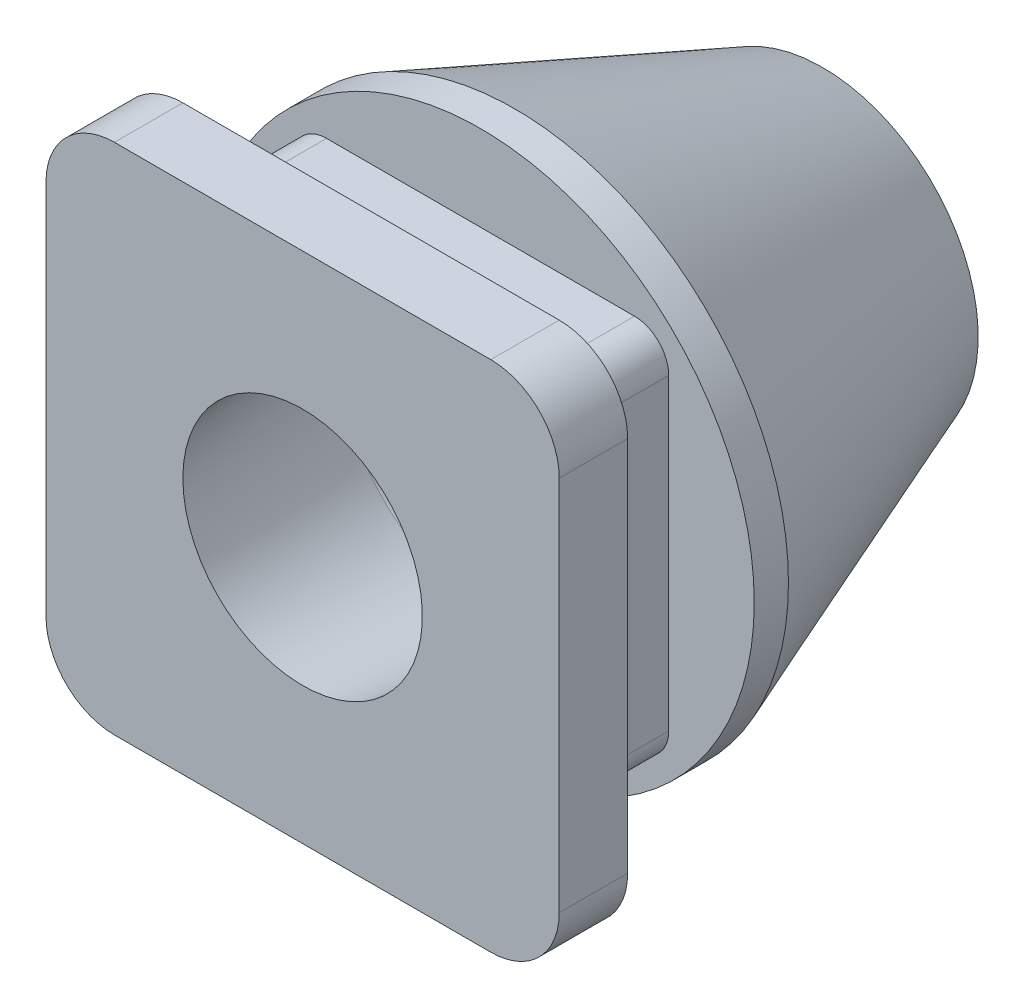
ISO-10303-21;
HEADER;
FILE_DESCRIPTION(('STEP AP214'),'2;1');
FILE_NAME('part.step','',(''),(''),'','','');
FILE_SCHEMA(('AUTOMOTIVE_DESIGN { 1 0 10303 214 1 1 1 1 }'));
ENDSEC;
DATA;
#1=APPLICATION_CONTEXT('core data for automotive mechanical design processes');
#2=APPLICATION_PROTOCOL_DEFINITION('international standard','automotive_design',2000,#1);
#3=PRODUCT_CONTEXT('',#1,'mechanical');
#4=PRODUCT('Part','Part','',(#3));
#5=PRODUCT_RELATED_PRODUCT_CATEGORY('part','',(#4));
#6=PRODUCT_DEFINITION_FORMATION('','',#4);
#7=PRODUCT_DEFINITION_CONTEXT('part definition',#1,'design');
#8=PRODUCT_DEFINITION('design','',#6,#7);
#9=PRODUCT_DEFINITION_SHAPE('','',#8);
#10=(LENGTH_UNIT() NAMED_UNIT(*) SI_UNIT(.MILLI.,.METRE.));
#11=(NAMED_UNIT(*) PLANE_ANGLE_UNIT() SI_UNIT($,.RADIAN.));
#12=(NAMED_UNIT(*) SI_UNIT($,.STERADIAN.) SOLID_ANGLE_UNIT());
#13=UNCERTAINTY_MEASURE_WITH_UNIT(LENGTH_MEASURE(1.E-05),#10,'distance_accuracy_value','');
#14=(GEOMETRIC_REPRESENTATION_CONTEXT(3) GLOBAL_UNCERTAINTY_ASSIGNED_CONTEXT((#13)) GLOBAL_UNIT_ASSIGNED_CONTEXT((#10,
#11,#12)) REPRESENTATION_CONTEXT('',''));
#15=CARTESIAN_POINT('',(0.,0.,0.));
#16=DIRECTION('',(0.,0.,1.));
#17=DIRECTION('',(1.,0.,0.));
#18=AXIS2_PLACEMENT_3D('',#15,#16,#17);
#19=CARTESIAN_POINT('',(0.,0.,2.));
#20=DIRECTION('',(0.,0.,-1.));
#21=DIRECTION('',(-1.,0.,0.));
#22=AXIS2_PLACEMENT_3D('',#19,#20,#21);
#23=PLANE('',#22);
#24=DIRECTION('',(1.,0.,0.));
#25=VECTOR('',#24,1.);
#26=CARTESIAN_POINT('',(-7.5,-7.5,2.));
#27=LINE('',#26,#25);
#28=CARTESIAN_POINT('',(-5.5,-7.5,2.));
#29=VERTEX_POINT('',#28);
#30=CARTESIAN_POINT('',(5.5,-7.5,2.));
#31=VERTEX_POINT('',#30);
#32=EDGE_CURVE('E192',#29,#31,#27,.T.);
#33=ORIENTED_EDGE('',*,*,#32,.T.);
#34=CARTESIAN_POINT('',(5.5,-5.5,2.));
#35=DIRECTION('',(0.,0.,-1.));
#36=DIRECTION('',(-1.,0.,0.));
#37=AXIS2_PLACEMENT_3D('',#34,#35,#36);
#38=CIRCLE('',#37,2.);
#39=CARTESIAN_POINT('',(7.5,-5.5,2.));
#40=VERTEX_POINT('',#39);
#41=EDGE_CURVE('E222',#31,#40,#38,.F.);
#42=ORIENTED_EDGE('',*,*,#41,.T.);
#43=DIRECTION('',(0.,1.,0.));
#44=VECTOR('',#43,1.);
#45=CARTESIAN_POINT('',(7.5,-7.5,2.));
#46=LINE('',#45,#44);
#47=CARTESIAN_POINT('',(7.5,5.5,2.));
#48=VERTEX_POINT('',#47);
#49=EDGE_CURVE('E176',#40,#48,#46,.T.);
#50=ORIENTED_EDGE('',*,*,#49,.T.);
#51=CARTESIAN_POINT('',(5.5,5.5,2.));
#52=DIRECTION('',(0.,0.,-1.));
#53=DIRECTION('',(-1.,0.,0.));
#54=AXIS2_PLACEMENT_3D('',#51,#52,#53);
#55=CIRCLE('',#54,2.);
#56=CARTESIAN_POINT('',(5.5,7.5,2.));
#57=VERTEX_POINT('',#56);
#58=EDGE_CURVE('E216',#48,#57,#55,.F.);
#59=ORIENTED_EDGE('',*,*,#58,.T.);
#60=DIRECTION('',(-1.,0.,0.));
#61=VECTOR('',#60,1.);
#62=CARTESIAN_POINT('',(-7.5,7.5,2.));
#63=LINE('',#62,#61);
#64=CARTESIAN_POINT('',(-5.5,7.5,2.));
#65=VERTEX_POINT('',#64);
#66=EDGE_CURVE('E297',#57,#65,#63,.T.);
#67=ORIENTED_EDGE('',*,*,#66,.T.);
#68=CARTESIAN_POINT('',(-5.5,5.5,2.));
#69=DIRECTION('',(0.,0.,-1.));
#70=DIRECTION('',(-1.,0.,0.));
#71=AXIS2_PLACEMENT_3D('',#68,#69,#70);
#72=CIRCLE('',#71,2.);
#73=CARTESIAN_POINT('',(-7.5,5.5,2.));
#74=VERTEX_POINT('',#73);
#75=EDGE_CURVE('E218',#65,#74,#72,.F.);
#76=ORIENTED_EDGE('',*,*,#75,.T.);
#77=DIRECTION('',(0.,-1.,0.));
#78=VECTOR('',#77,1.);
#79=CARTESIAN_POINT('',(-7.5,-7.5,2.));
#80=LINE('',#79,#78);
#81=CARTESIAN_POINT('',(-7.5,-5.5,2.));
#82=VERTEX_POINT('',#81);
#83=EDGE_CURVE('E299',#74,#82,#80,.T.);
#84=ORIENTED_EDGE('',*,*,#83,.T.);
#85=CARTESIAN_POINT('',(-5.5,-5.5,2.));
#86=DIRECTION('',(0.,0.,-1.));
#87=DIRECTION('',(-1.,0.,0.));
#88=AXIS2_PLACEMENT_3D('',#85,#86,#87);
#89=CIRCLE('',#88,2.);
#90=EDGE_CURVE('E220',#82,#29,#89,.F.);
#91=ORIENTED_EDGE('',*,*,#90,.T.);
#92=EDGE_LOOP('',(#33,#42,#50,#59,#67,#76,#84,#91));
#93=FACE_BOUND('',#92,.T.);
#94=CARTESIAN_POINT('',(0.,0.,2.));
#95=DIRECTION('',(0.,0.,-1.));
#96=DIRECTION('',(-1.,0.,0.));
#97=AXIS2_PLACEMENT_3D('',#94,#95,#96);
#98=CIRCLE('',#97,3.5);
#99=CARTESIAN_POINT('',(-3.5,0.,2.));
#100=VERTEX_POINT('',#99);
#101=EDGE_CURVE('E664',#100,#100,#98,.T.);
#102=ORIENTED_EDGE('',*,*,#101,.T.);
#103=EDGE_LOOP('',(#102));
#104=FACE_BOUND('',#103,.T.);
#105=ADVANCED_FACE('F43',(#93,#104),#23,.F.);
#106=CARTESIAN_POINT('',(0.,0.,0.));
#107=DIRECTION('',(0.,0.,-1.));
#108=DIRECTION('',(-1.,0.,0.));
#109=AXIS2_PLACEMENT_3D('',#106,#107,#108);
#110=PLANE('',#109);
#111=DIRECTION('',(0.,1.,0.));
#112=VECTOR('',#111,1.);
#113=CARTESIAN_POINT('',(-5.5,5.5,0.));
#114=LINE('',#113,#112);
#115=CARTESIAN_POINT('',(-5.5,-4.5,0.));
#116=VERTEX_POINT('',#115);
#117=CARTESIAN_POINT('',(-5.5,4.5,0.));
#118=VERTEX_POINT('',#117);
#119=EDGE_CURVE('E268',#116,#118,#114,.T.);
#120=ORIENTED_EDGE('',*,*,#119,.F.);
#121=CARTESIAN_POINT('',(-4.5,-4.5,0.));
#122=DIRECTION('',(0.,0.,-1.));
#123=DIRECTION('',(-1.,0.,0.));
#124=AXIS2_PLACEMENT_3D('',#121,#122,#123);
#125=CIRCLE('',#124,1.);
#126=CARTESIAN_POINT('',(-4.5,-5.5,0.));
#127=VERTEX_POINT('',#126);
#128=EDGE_CURVE('E253',#116,#127,#125,.F.);
#129=ORIENTED_EDGE('',*,*,#128,.T.);
#130=DIRECTION('',(-1.,0.,0.));
#131=VECTOR('',#130,1.);
#132=CARTESIAN_POINT('',(5.5,-5.5,0.));
#133=LINE('',#132,#131);
#134=CARTESIAN_POINT('',(4.5,-5.5,0.));
#135=VERTEX_POINT('',#134);
#136=EDGE_CURVE('E286',#135,#127,#133,.T.);
#137=ORIENTED_EDGE('',*,*,#136,.F.);
#138=CARTESIAN_POINT('',(4.5,-4.5,0.));
#139=DIRECTION('',(0.,0.,-1.));
#140=DIRECTION('',(-1.,0.,0.));
#141=AXIS2_PLACEMENT_3D('',#138,#139,#140);
#142=CIRCLE('',#141,1.);
#143=CARTESIAN_POINT('',(5.5,-4.5,0.));
#144=VERTEX_POINT('',#143);
#145=EDGE_CURVE('E257',#135,#144,#142,.F.);
#146=ORIENTED_EDGE('',*,*,#145,.T.);
#147=DIRECTION('',(0.,-1.,0.));
#148=VECTOR('',#147,1.);
#149=CARTESIAN_POINT('',(5.5,5.5,0.));
#150=LINE('',#149,#148);
#151=CARTESIAN_POINT('',(5.5,4.5,0.));
#152=VERTEX_POINT('',#151);
#153=EDGE_CURVE('E291',#152,#144,#150,.T.);
#154=ORIENTED_EDGE('',*,*,#153,.F.);
#155=CARTESIAN_POINT('',(4.5,4.5,0.));
#156=DIRECTION('',(0.,0.,-1.));
#157=DIRECTION('',(-1.,0.,0.));
#158=AXIS2_PLACEMENT_3D('',#155,#156,#157);
#159=CIRCLE('',#158,1.);
#160=CARTESIAN_POINT('',(4.5,5.5,0.));
#161=VERTEX_POINT('',#160);
#162=EDGE_CURVE('E261',#152,#161,#159,.F.);
#163=ORIENTED_EDGE('',*,*,#162,.T.);
#164=DIRECTION('',(1.,0.,0.));
#165=VECTOR('',#164,1.);
#166=CARTESIAN_POINT('',(5.5,5.5,0.));
#167=LINE('',#166,#165);
#168=CARTESIAN_POINT('',(-4.5,5.5,0.));
#169=VERTEX_POINT('',#168);
#170=EDGE_CURVE('E269',#169,#161,#167,.T.);
#171=ORIENTED_EDGE('',*,*,#170,.F.);
#172=CARTESIAN_POINT('',(-4.5,4.5,0.));
#173=DIRECTION('',(0.,0.,-1.));
#174=DIRECTION('',(-1.,0.,0.));
#175=AXIS2_PLACEMENT_3D('',#172,#173,#174);
#176=CIRCLE('',#175,1.);
#177=EDGE_CURVE('E51',#169,#118,#176,.F.);
#178=ORIENTED_EDGE('',*,*,#177,.T.);
#179=EDGE_LOOP('',(#120,#129,#137,#146,#154,#163,#171,#178));
#180=FACE_BOUND('',#179,.T.);
#181=DIRECTION('',(0.,1.,0.));
#182=VECTOR('',#181,1.);
#183=CARTESIAN_POINT('',(7.5,-7.5,0.));
#184=LINE('',#183,#182);
#185=CARTESIAN_POINT('',(7.5,-5.5,0.));
#186=VERTEX_POINT('',#185);
#187=CARTESIAN_POINT('',(7.5,5.5,0.));
#188=VERTEX_POINT('',#187);
#189=EDGE_CURVE('E173',#186,#188,#184,.T.);
#190=ORIENTED_EDGE('',*,*,#189,.F.);
#191=CARTESIAN_POINT('',(5.5,-5.5,0.));
#192=DIRECTION('',(0.,0.,-1.));
#193=DIRECTION('',(-1.,0.,0.));
#194=AXIS2_PLACEMENT_3D('',#191,#192,#193);
#195=CIRCLE('',#194,2.);
#196=CARTESIAN_POINT('',(5.5,-7.5,0.));
#197=VERTEX_POINT('',#196);
#198=EDGE_CURVE('E156',#186,#197,#195,.T.);
#199=ORIENTED_EDGE('',*,*,#198,.T.);
#200=DIRECTION('',(1.,0.,0.));
#201=VECTOR('',#200,1.);
#202=CARTESIAN_POINT('',(-7.5,-7.5,0.));
#203=LINE('',#202,#201);
#204=CARTESIAN_POINT('',(-5.5,-7.5,0.));
#205=VERTEX_POINT('',#204);
#206=EDGE_CURVE('E197',#205,#197,#203,.T.);
#207=ORIENTED_EDGE('',*,*,#206,.F.);
#208=CARTESIAN_POINT('',(-5.5,-5.5,0.));
#209=DIRECTION('',(0.,0.,-1.));
#210=DIRECTION('',(-1.,0.,0.));
#211=AXIS2_PLACEMENT_3D('',#208,#209,#210);
#212=CIRCLE('',#211,2.);
#213=CARTESIAN_POINT('',(-7.5,-5.5,0.));
#214=VERTEX_POINT('',#213);
#215=EDGE_CURVE('E167',#205,#214,#212,.T.);
#216=ORIENTED_EDGE('',*,*,#215,.T.);
#217=DIRECTION('',(0.,-1.,0.));
#218=VECTOR('',#217,1.);
#219=CARTESIAN_POINT('',(-7.5,-7.5,0.));
#220=LINE('',#219,#218);
#221=CARTESIAN_POINT('',(-7.5,5.5,0.));
#222=VERTEX_POINT('',#221);
#223=EDGE_CURVE('E186',#222,#214,#220,.T.);
#224=ORIENTED_EDGE('',*,*,#223,.F.);
#225=CARTESIAN_POINT('',(-5.5,5.5,0.));
#226=DIRECTION('',(0.,0.,-1.));
#227=DIRECTION('',(-1.,0.,0.));
#228=AXIS2_PLACEMENT_3D('',#225,#226,#227);
#229=CIRCLE('',#228,2.);
#230=CARTESIAN_POINT('',(-5.5,7.5,0.));
#231=VERTEX_POINT('',#230);
#232=EDGE_CURVE('E210',#222,#231,#229,.T.);
#233=ORIENTED_EDGE('',*,*,#232,.T.);
#234=DIRECTION('',(-1.,0.,0.));
#235=VECTOR('',#234,1.);
#236=CARTESIAN_POINT('',(-7.5,7.5,0.));
#237=LINE('',#236,#235);
#238=CARTESIAN_POINT('',(5.5,7.5,0.));
#239=VERTEX_POINT('',#238);
#240=EDGE_CURVE('E182',#239,#231,#237,.T.);
#241=ORIENTED_EDGE('',*,*,#240,.F.);
#242=CARTESIAN_POINT('',(5.5,5.5,0.));
#243=DIRECTION('',(0.,0.,-1.));
#244=DIRECTION('',(-1.,0.,0.));
#245=AXIS2_PLACEMENT_3D('',#242,#243,#244);
#246=CIRCLE('',#245,2.);
#247=EDGE_CURVE('E177',#239,#188,#246,.T.);
#248=ORIENTED_EDGE('',*,*,#247,.T.);
#249=EDGE_LOOP('',(#190,#199,#207,#216,#224,#233,#241,#248));
#250=FACE_BOUND('',#249,.T.);
#251=ADVANCED_FACE('F180',(#180,#250),#110,.T.);
#252=CARTESIAN_POINT('',(7.5,-7.5,2.));
#253=DIRECTION('',(-1.,0.,0.));
#254=DIRECTION('',(0.,0.,1.));
#255=AXIS2_PLACEMENT_3D('',#252,#253,#254);
#256=PLANE('',#255);
#257=ORIENTED_EDGE('',*,*,#49,.F.);
#258=DIRECTION('',(0.,0.,-1.));
#259=VECTOR('',#258,1.);
#260=CARTESIAN_POINT('',(7.5,-5.5,2.));
#261=LINE('',#260,#259);
#262=EDGE_CURVE('E160',#40,#186,#261,.T.);
#263=ORIENTED_EDGE('',*,*,#262,.T.);
#264=ORIENTED_EDGE('',*,*,#189,.T.);
#265=DIRECTION('',(0.,0.,-1.));
#266=VECTOR('',#265,1.);
#267=CARTESIAN_POINT('',(7.5,5.5,2.));
#268=LINE('',#267,#266);
#269=EDGE_CURVE('E178',#188,#48,#268,.F.);
#270=ORIENTED_EDGE('',*,*,#269,.T.);
#271=EDGE_LOOP('',(#257,#263,#264,#270));
#272=FACE_BOUND('',#271,.T.);
#273=ADVANCED_FACE('F172',(#272),#256,.F.);
#274=CARTESIAN_POINT('',(-7.5,7.5,2.));
#275=DIRECTION('',(0.,-1.,0.));
#276=DIRECTION('',(0.,0.,-1.));
#277=AXIS2_PLACEMENT_3D('',#274,#275,#276);
#278=PLANE('',#277);
#279=ORIENTED_EDGE('',*,*,#240,.T.);
#280=DIRECTION('',(0.,0.,-1.));
#281=VECTOR('',#280,1.);
#282=CARTESIAN_POINT('',(-5.5,7.5,2.));
#283=LINE('',#282,#281);
#284=EDGE_CURVE('E232',#231,#65,#283,.F.);
#285=ORIENTED_EDGE('',*,*,#284,.T.);
#286=ORIENTED_EDGE('',*,*,#66,.F.);
#287=DIRECTION('',(0.,0.,-1.));
#288=VECTOR('',#287,1.);
#289=CARTESIAN_POINT('',(5.5,7.5,2.));
#290=LINE('',#289,#288);
#291=EDGE_CURVE('E229',#57,#239,#290,.T.);
#292=ORIENTED_EDGE('',*,*,#291,.T.);
#293=EDGE_LOOP('',(#279,#285,#286,#292));
#294=FACE_BOUND('',#293,.T.);
#295=ADVANCED_FACE('F322',(#294),#278,.F.);
#296=CARTESIAN_POINT('',(-7.5,-7.5,2.));
#297=DIRECTION('',(1.,0.,0.));
#298=DIRECTION('',(0.,0.,-1.));
#299=AXIS2_PLACEMENT_3D('',#296,#297,#298);
#300=PLANE('',#299);
#301=ORIENTED_EDGE('',*,*,#223,.T.);
#302=DIRECTION('',(0.,0.,-1.));
#303=VECTOR('',#302,1.);
#304=CARTESIAN_POINT('',(-7.5,-5.5,2.));
#305=LINE('',#304,#303);
#306=EDGE_CURVE('E227',#214,#82,#305,.F.);
#307=ORIENTED_EDGE('',*,*,#306,.T.);
#308=ORIENTED_EDGE('',*,*,#83,.F.);
#309=DIRECTION('',(0.,0.,-1.));
#310=VECTOR('',#309,1.);
#311=CARTESIAN_POINT('',(-7.5,5.5,2.));
#312=LINE('',#311,#310);
#313=EDGE_CURVE('E224',#74,#222,#312,.T.);
#314=ORIENTED_EDGE('',*,*,#313,.T.);
#315=EDGE_LOOP('',(#301,#307,#308,#314));
#316=FACE_BOUND('',#315,.T.);
#317=ADVANCED_FACE('F315',(#316),#300,.F.);
#318=CARTESIAN_POINT('',(-7.5,-7.5,2.));
#319=DIRECTION('',(0.,1.,0.));
#320=DIRECTION('',(0.,0.,1.));
#321=AXIS2_PLACEMENT_3D('',#318,#319,#320);
#322=PLANE('',#321);
#323=ORIENTED_EDGE('',*,*,#206,.T.);
#324=DIRECTION('',(0.,0.,-1.));
#325=VECTOR('',#324,1.);
#326=CARTESIAN_POINT('',(5.5,-7.5,2.));
#327=LINE('',#326,#325);
#328=EDGE_CURVE('E161',#197,#31,#327,.F.);
#329=ORIENTED_EDGE('',*,*,#328,.T.);
#330=ORIENTED_EDGE('',*,*,#32,.F.);
#331=DIRECTION('',(0.,0.,-1.));
#332=VECTOR('',#331,1.);
#333=CARTESIAN_POINT('',(-5.5,-7.5,2.));
#334=LINE('',#333,#332);
#335=EDGE_CURVE('E166',#29,#205,#334,.T.);
#336=ORIENTED_EDGE('',*,*,#335,.T.);
#337=EDGE_LOOP('',(#323,#329,#330,#336));
#338=FACE_BOUND('',#337,.T.);
#339=ADVANCED_FACE('F309',(#338),#322,.F.);
#340=CARTESIAN_POINT('',(0.,0.,2.));
#341=DIRECTION('',(0.,0.,-1.));
#342=DIRECTION('',(-1.,0.,0.));
#343=AXIS2_PLACEMENT_3D('',#340,#341,#342);
#344=CYLINDRICAL_SURFACE('',#343,4.);
#345=CARTESIAN_POINT('',(0.,0.,-3.2));
#346=DIRECTION('',(0.,0.,-1.));
#347=DIRECTION('',(-1.,0.,0.));
#348=AXIS2_PLACEMENT_3D('',#345,#346,#347);
#349=CIRCLE('',#348,4.);
#350=CARTESIAN_POINT('',(-4.,0.,-3.2));
#351=VERTEX_POINT('',#350);
#352=EDGE_CURVE('E199',#351,#351,#349,.T.);
#353=ORIENTED_EDGE('',*,*,#352,.F.);
#354=EDGE_LOOP('',(#353));
#355=FACE_BOUND('',#354,.T.);
#356=CARTESIAN_POINT('',(0.,0.,-13.2));
#357=DIRECTION('',(0.,0.,-1.));
#358=DIRECTION('',(-1.,0.,0.));
#359=AXIS2_PLACEMENT_3D('',#356,#357,#358);
#360=CIRCLE('',#359,4.);
#361=CARTESIAN_POINT('',(-4.,0.,-13.2));
#362=VERTEX_POINT('',#361);
#363=EDGE_CURVE('E662',#362,#362,#360,.T.);
#364=ORIENTED_EDGE('',*,*,#363,.T.);
#365=EDGE_LOOP('',(#364));
#366=FACE_BOUND('',#365,.T.);
#367=ADVANCED_FACE('F346',(#355,#366),#344,.F.);
#368=CARTESIAN_POINT('',(-5.5,5.5,-3.2));
#369=DIRECTION('',(1.,0.,0.));
#370=DIRECTION('',(0.,1.,0.));
#371=AXIS2_PLACEMENT_3D('',#368,#369,#370);
#372=PLANE('',#371);
#373=DIRECTION('',(0.,1.,0.));
#374=VECTOR('',#373,1.);
#375=CARTESIAN_POINT('',(-5.5,5.5,-3.2));
#376=LINE('',#375,#374);
#377=CARTESIAN_POINT('',(-5.5,-4.5,-3.2));
#378=VERTEX_POINT('',#377);
#379=CARTESIAN_POINT('',(-5.5,4.5,-3.2));
#380=VERTEX_POINT('',#379);
#381=EDGE_CURVE('E282',#378,#380,#376,.T.);
#382=ORIENTED_EDGE('',*,*,#381,.F.);
#383=DIRECTION('',(0.,0.,1.));
#384=VECTOR('',#383,1.);
#385=CARTESIAN_POINT('',(-5.5,-4.5,-3.2));
#386=LINE('',#385,#384);
#387=EDGE_CURVE('E236',#378,#116,#386,.T.);
#388=ORIENTED_EDGE('',*,*,#387,.T.);
#389=ORIENTED_EDGE('',*,*,#119,.T.);
#390=DIRECTION('',(0.,0.,1.));
#391=VECTOR('',#390,1.);
#392=CARTESIAN_POINT('',(-5.5,4.5,-3.2));
#393=LINE('',#392,#391);
#394=EDGE_CURVE('E234',#118,#380,#393,.F.);
#395=ORIENTED_EDGE('',*,*,#394,.T.);
#396=EDGE_LOOP('',(#382,#388,#389,#395));
#397=FACE_BOUND('',#396,.T.);
#398=ADVANCED_FACE('F275',(#397),#372,.F.);
#399=CARTESIAN_POINT('',(5.5,5.5,-3.2));
#400=DIRECTION('',(0.,-1.,0.));
#401=DIRECTION('',(0.,0.,-1.));
#402=AXIS2_PLACEMENT_3D('',#399,#400,#401);
#403=PLANE('',#402);
#404=ORIENTED_EDGE('',*,*,#170,.T.);
#405=DIRECTION('',(0.,0.,1.));
#406=VECTOR('',#405,1.);
#407=CARTESIAN_POINT('',(4.5,5.5,-3.2));
#408=LINE('',#407,#406);
#409=CARTESIAN_POINT('',(4.5,5.5,-3.2));
#410=VERTEX_POINT('',#409);
#411=EDGE_CURVE('E58',#161,#410,#408,.F.);
#412=ORIENTED_EDGE('',*,*,#411,.T.);
#413=DIRECTION('',(1.,0.,0.));
#414=VECTOR('',#413,1.);
#415=CARTESIAN_POINT('',(5.5,5.5,-3.2));
#416=LINE('',#415,#414);
#417=CARTESIAN_POINT('',(-4.5,5.5,-3.2));
#418=VERTEX_POINT('',#417);
#419=EDGE_CURVE('E280',#418,#410,#416,.T.);
#420=ORIENTED_EDGE('',*,*,#419,.F.);
#421=DIRECTION('',(0.,0.,1.));
#422=VECTOR('',#421,1.);
#423=CARTESIAN_POINT('',(-4.5,5.5,-3.2));
#424=LINE('',#423,#422);
#425=EDGE_CURVE('E249',#418,#169,#424,.T.);
#426=ORIENTED_EDGE('',*,*,#425,.T.);
#427=EDGE_LOOP('',(#404,#412,#420,#426));
#428=FACE_BOUND('',#427,.T.);
#429=ADVANCED_FACE('F279',(#428),#403,.F.);
#430=CARTESIAN_POINT('',(5.5,5.5,-3.2));
#431=DIRECTION('',(-1.,0.,0.));
#432=DIRECTION('',(0.,-1.,0.));
#433=AXIS2_PLACEMENT_3D('',#430,#431,#432);
#434=PLANE('',#433);
#435=ORIENTED_EDGE('',*,*,#153,.T.);
#436=DIRECTION('',(0.,0.,1.));
#437=VECTOR('',#436,1.);
#438=CARTESIAN_POINT('',(5.5,-4.5,-3.2));
#439=LINE('',#438,#437);
#440=CARTESIAN_POINT('',(5.5,-4.5,-3.2));
#441=VERTEX_POINT('',#440);
#442=EDGE_CURVE('E247',#144,#441,#439,.F.);
#443=ORIENTED_EDGE('',*,*,#442,.T.);
#444=DIRECTION('',(0.,-1.,0.));
#445=VECTOR('',#444,1.);
#446=CARTESIAN_POINT('',(5.5,5.5,-3.2));
#447=LINE('',#446,#445);
#448=CARTESIAN_POINT('',(5.5,4.5,-3.2));
#449=VERTEX_POINT('',#448);
#450=EDGE_CURVE('E189',#449,#441,#447,.T.);
#451=ORIENTED_EDGE('',*,*,#450,.F.);
#452=DIRECTION('',(0.,0.,1.));
#453=VECTOR('',#452,1.);
#454=CARTESIAN_POINT('',(5.5,4.5,-3.2));
#455=LINE('',#454,#453);
#456=EDGE_CURVE('E244',#449,#152,#455,.T.);
#457=ORIENTED_EDGE('',*,*,#456,.T.);
#458=EDGE_LOOP('',(#435,#443,#451,#457));
#459=FACE_BOUND('',#458,.T.);
#460=ADVANCED_FACE('F541',(#459),#434,.F.);
#461=CARTESIAN_POINT('',(5.5,-5.5,-3.2));
#462=DIRECTION('',(0.,1.,0.));
#463=DIRECTION('',(0.,0.,1.));
#464=AXIS2_PLACEMENT_3D('',#461,#462,#463);
#465=PLANE('',#464);
#466=ORIENTED_EDGE('',*,*,#136,.T.);
#467=DIRECTION('',(0.,0.,1.));
#468=VECTOR('',#467,1.);
#469=CARTESIAN_POINT('',(-4.5,-5.5,-3.2));
#470=LINE('',#469,#468);
#471=CARTESIAN_POINT('',(-4.5,-5.5,-3.2));
#472=VERTEX_POINT('',#471);
#473=EDGE_CURVE('E242',#127,#472,#470,.F.);
#474=ORIENTED_EDGE('',*,*,#473,.T.);
#475=DIRECTION('',(-1.,0.,0.));
#476=VECTOR('',#475,1.);
#477=CARTESIAN_POINT('',(5.5,-5.5,-3.2));
#478=LINE('',#477,#476);
#479=CARTESIAN_POINT('',(4.5,-5.5,-3.2));
#480=VERTEX_POINT('',#479);
#481=EDGE_CURVE('E183',#480,#472,#478,.T.);
#482=ORIENTED_EDGE('',*,*,#481,.F.);
#483=DIRECTION('',(0.,0.,1.));
#484=VECTOR('',#483,1.);
#485=CARTESIAN_POINT('',(4.5,-5.5,-3.2));
#486=LINE('',#485,#484);
#487=EDGE_CURVE('E239',#480,#135,#486,.T.);
#488=ORIENTED_EDGE('',*,*,#487,.T.);
#489=EDGE_LOOP('',(#466,#474,#482,#488));
#490=FACE_BOUND('',#489,.T.);
#491=ADVANCED_FACE('F517',(#490),#465,.F.);
#492=CARTESIAN_POINT('',(0.,0.,-3.2));
#493=DIRECTION('',(0.,0.,-1.));
#494=DIRECTION('',(-1.,0.,0.));
#495=AXIS2_PLACEMENT_3D('',#492,#493,#494);
#496=PLANE('',#495);
#497=CARTESIAN_POINT('',(0.,0.,-3.2));
#498=DIRECTION('',(0.,0.,-1.));
#499=DIRECTION('',(-1.,0.,0.));
#500=AXIS2_PLACEMENT_3D('',#497,#498,#499);
#501=CIRCLE('',#500,8.);
#502=CARTESIAN_POINT('',(-8.,0.,-3.2));
#503=VERTEX_POINT('',#502);
#504=EDGE_CURVE('E277',#503,#503,#501,.T.);
#505=ORIENTED_EDGE('',*,*,#504,.F.);
#506=EDGE_LOOP('',(#505));
#507=FACE_BOUND('',#506,.T.);
#508=ORIENTED_EDGE('',*,*,#450,.T.);
#509=CARTESIAN_POINT('',(4.5,-4.5,-3.2));
#510=DIRECTION('',(0.,0.,-1.));
#511=DIRECTION('',(-1.,0.,0.));
#512=AXIS2_PLACEMENT_3D('',#509,#510,#511);
#513=CIRCLE('',#512,1.);
#514=EDGE_CURVE('E259',#441,#480,#513,.T.);
#515=ORIENTED_EDGE('',*,*,#514,.T.);
#516=ORIENTED_EDGE('',*,*,#481,.T.);
#517=CARTESIAN_POINT('',(-4.5,-4.5,-3.2));
#518=DIRECTION('',(0.,0.,-1.));
#519=DIRECTION('',(-1.,0.,0.));
#520=AXIS2_PLACEMENT_3D('',#517,#518,#519);
#521=CIRCLE('',#520,1.);
#522=EDGE_CURVE('E255',#472,#378,#521,.T.);
#523=ORIENTED_EDGE('',*,*,#522,.T.);
#524=ORIENTED_EDGE('',*,*,#381,.T.);
#525=CARTESIAN_POINT('',(-4.5,4.5,-3.2));
#526=DIRECTION('',(0.,0.,-1.));
#527=DIRECTION('',(-1.,0.,0.));
#528=AXIS2_PLACEMENT_3D('',#525,#526,#527);
#529=CIRCLE('',#528,1.);
#530=EDGE_CURVE('E11',#380,#418,#529,.T.);
#531=ORIENTED_EDGE('',*,*,#530,.T.);
#532=ORIENTED_EDGE('',*,*,#419,.T.);
#533=CARTESIAN_POINT('',(4.5,4.5,-3.2));
#534=DIRECTION('',(0.,0.,-1.));
#535=DIRECTION('',(-1.,0.,0.));
#536=AXIS2_PLACEMENT_3D('',#533,#534,#535);
#537=CIRCLE('',#536,1.);
#538=EDGE_CURVE('E263',#410,#449,#537,.T.);
#539=ORIENTED_EDGE('',*,*,#538,.T.);
#540=EDGE_LOOP('',(#508,#515,#516,#523,#524,#531,#532,#539));
#541=FACE_BOUND('',#540,.T.);
#542=ADVANCED_FACE('F506',(#507,#541),#496,.F.);
#543=CARTESIAN_POINT('',(0.,0.,-13.2));
#544=DIRECTION('',(0.,0.,-1.));
#545=DIRECTION('',(-1.,0.,0.));
#546=AXIS2_PLACEMENT_3D('',#543,#544,#545);
#547=PLANE('',#546);
#548=CARTESIAN_POINT('',(0.,0.,-13.2));
#549=DIRECTION('',(0.,0.,-1.));
#550=DIRECTION('',(-1.,0.,0.));
#551=AXIS2_PLACEMENT_3D('',#548,#549,#550);
#552=CIRCLE('',#551,4.54522368468125);
#553=CARTESIAN_POINT('',(-4.54522368468125,0.,-13.2));
#554=VERTEX_POINT('',#553);
#555=EDGE_CURVE('E202',#554,#554,#552,.T.);
#556=ORIENTED_EDGE('',*,*,#555,.T.);
#557=EDGE_LOOP('',(#556));
#558=FACE_BOUND('',#557,.T.);
#559=ORIENTED_EDGE('',*,*,#363,.F.);
#560=EDGE_LOOP('',(#559));
#561=FACE_BOUND('',#560,.T.);
#562=ADVANCED_FACE('F495',(#558,#561),#547,.T.);
#563=CARTESIAN_POINT('',(0.,0.,-13.2));
#564=DIRECTION('',(0.,0.,1.));
#565=DIRECTION('',(1.,0.,0.));
#566=AXIS2_PLACEMENT_3D('',#563,#564,#565);
#567=CYLINDRICAL_SURFACE('',#566,8.);
#568=CARTESIAN_POINT('',(0.,0.,-4.19999999999993));
#569=DIRECTION('',(0.,0.,-1.));
#570=DIRECTION('',(-1.,0.,0.));
#571=AXIS2_PLACEMENT_3D('',#568,#569,#570);
#572=CIRCLE('',#571,8.);
#573=CARTESIAN_POINT('',(-8.,0.,-4.19999999999993));
#574=VERTEX_POINT('',#573);
#575=EDGE_CURVE('E205',#574,#574,#572,.F.);
#576=ORIENTED_EDGE('',*,*,#575,.T.);
#577=EDGE_LOOP('',(#576));
#578=FACE_BOUND('',#577,.T.);
#579=ORIENTED_EDGE('',*,*,#504,.T.);
#580=EDGE_LOOP('',(#579));
#581=FACE_BOUND('',#580,.T.);
#582=ADVANCED_FACE('F472',(#578,#581),#567,.T.);
#583=CARTESIAN_POINT('',(0.,0.,2.));
#584=DIRECTION('',(0.,0.,-1.));
#585=DIRECTION('',(-1.,0.,0.));
#586=AXIS2_PLACEMENT_3D('',#583,#584,#585);
#587=CONICAL_SURFACE('',#586,3.5,0.0958591471100132);
#588=ORIENTED_EDGE('',*,*,#352,.T.);
#589=EDGE_LOOP('',(#588));
#590=FACE_BOUND('',#589,.T.);
#591=ORIENTED_EDGE('',*,*,#101,.F.);
#592=EDGE_LOOP('',(#591));
#593=FACE_BOUND('',#592,.T.);
#594=ADVANCED_FACE('F363',(#590,#593),#587,.F.);
#595=CARTESIAN_POINT('',(0.,0.,-13.2));
#596=DIRECTION('',(0.,0.,1.));
#597=DIRECTION('',(1.,0.,0.));
#598=AXIS2_PLACEMENT_3D('',#595,#596,#597);
#599=CONICAL_SURFACE('',#598,4.54522368468125,0.366519142918807);
#600=ORIENTED_EDGE('',*,*,#575,.F.);
#601=EDGE_LOOP('',(#600));
#602=FACE_BOUND('',#601,.T.);
#603=ORIENTED_EDGE('',*,*,#555,.F.);
#604=EDGE_LOOP('',(#603));
#605=FACE_BOUND('',#604,.T.);
#606=ADVANCED_FACE('F358',(#602,#605),#599,.T.);
#607=CARTESIAN_POINT('',(5.5,-5.5,2.));
#608=DIRECTION('',(0.,0.,-1.));
#609=DIRECTION('',(-1.,0.,0.));
#610=AXIS2_PLACEMENT_3D('',#607,#608,#609);
#611=CYLINDRICAL_SURFACE('',#610,2.);
#612=ORIENTED_EDGE('',*,*,#41,.F.);
#613=ORIENTED_EDGE('',*,*,#328,.F.);
#614=ORIENTED_EDGE('',*,*,#198,.F.);
#615=ORIENTED_EDGE('',*,*,#262,.F.);
#616=EDGE_LOOP('',(#612,#613,#614,#615));
#617=FACE_BOUND('',#616,.T.);
#618=ADVANCED_FACE('F159',(#617),#611,.T.);
#619=CARTESIAN_POINT('',(-5.5,-5.5,2.));
#620=DIRECTION('',(0.,0.,-1.));
#621=DIRECTION('',(-1.,0.,0.));
#622=AXIS2_PLACEMENT_3D('',#619,#620,#621);
#623=CYLINDRICAL_SURFACE('',#622,2.);
#624=ORIENTED_EDGE('',*,*,#90,.F.);
#625=ORIENTED_EDGE('',*,*,#306,.F.);
#626=ORIENTED_EDGE('',*,*,#215,.F.);
#627=ORIENTED_EDGE('',*,*,#335,.F.);
#628=EDGE_LOOP('',(#624,#625,#626,#627));
#629=FACE_BOUND('',#628,.T.);
#630=ADVANCED_FACE('F311',(#629),#623,.T.);
#631=CARTESIAN_POINT('',(-5.5,5.5,2.));
#632=DIRECTION('',(0.,0.,-1.));
#633=DIRECTION('',(-1.,0.,0.));
#634=AXIS2_PLACEMENT_3D('',#631,#632,#633);
#635=CYLINDRICAL_SURFACE('',#634,2.);
#636=ORIENTED_EDGE('',*,*,#75,.F.);
#637=ORIENTED_EDGE('',*,*,#284,.F.);
#638=ORIENTED_EDGE('',*,*,#232,.F.);
#639=ORIENTED_EDGE('',*,*,#313,.F.);
#640=EDGE_LOOP('',(#636,#637,#638,#639));
#641=FACE_BOUND('',#640,.T.);
#642=ADVANCED_FACE('F319',(#641),#635,.T.);
#643=CARTESIAN_POINT('',(5.5,5.5,2.));
#644=DIRECTION('',(0.,0.,-1.));
#645=DIRECTION('',(-1.,0.,0.));
#646=AXIS2_PLACEMENT_3D('',#643,#644,#645);
#647=CYLINDRICAL_SURFACE('',#646,2.);
#648=ORIENTED_EDGE('',*,*,#58,.F.);
#649=ORIENTED_EDGE('',*,*,#269,.F.);
#650=ORIENTED_EDGE('',*,*,#247,.F.);
#651=ORIENTED_EDGE('',*,*,#291,.F.);
#652=EDGE_LOOP('',(#648,#649,#650,#651));
#653=FACE_BOUND('',#652,.T.);
#654=ADVANCED_FACE('F327',(#653),#647,.T.);
#655=CARTESIAN_POINT('',(-4.5,-4.5,-3.2));
#656=DIRECTION('',(0.,0.,1.));
#657=DIRECTION('',(1.,0.,0.));
#658=AXIS2_PLACEMENT_3D('',#655,#656,#657);
#659=CYLINDRICAL_SURFACE('',#658,1.);
#660=ORIENTED_EDGE('',*,*,#522,.F.);
#661=ORIENTED_EDGE('',*,*,#473,.F.);
#662=ORIENTED_EDGE('',*,*,#128,.F.);
#663=ORIENTED_EDGE('',*,*,#387,.F.);
#664=EDGE_LOOP('',(#660,#661,#662,#663));
#665=FACE_BOUND('',#664,.T.);
#666=ADVANCED_FACE('F329',(#665),#659,.T.);
#667=CARTESIAN_POINT('',(4.5,-4.5,-3.2));
#668=DIRECTION('',(0.,0.,1.));
#669=DIRECTION('',(1.,0.,0.));
#670=AXIS2_PLACEMENT_3D('',#667,#668,#669);
#671=CYLINDRICAL_SURFACE('',#670,1.);
#672=ORIENTED_EDGE('',*,*,#514,.F.);
#673=ORIENTED_EDGE('',*,*,#442,.F.);
#674=ORIENTED_EDGE('',*,*,#145,.F.);
#675=ORIENTED_EDGE('',*,*,#487,.F.);
#676=EDGE_LOOP('',(#672,#673,#674,#675));
#677=FACE_BOUND('',#676,.T.);
#678=ADVANCED_FACE('F335',(#677),#671,.T.);
#679=CARTESIAN_POINT('',(4.5,4.5,-3.2));
#680=DIRECTION('',(0.,0.,1.));
#681=DIRECTION('',(1.,0.,0.));
#682=AXIS2_PLACEMENT_3D('',#679,#680,#681);
#683=CYLINDRICAL_SURFACE('',#682,1.);
#684=ORIENTED_EDGE('',*,*,#538,.F.);
#685=ORIENTED_EDGE('',*,*,#411,.F.);
#686=ORIENTED_EDGE('',*,*,#162,.F.);
#687=ORIENTED_EDGE('',*,*,#456,.F.);
#688=EDGE_LOOP('',(#684,#685,#686,#687));
#689=FACE_BOUND('',#688,.T.);
#690=ADVANCED_FACE('F397',(#689),#683,.T.);
#691=CARTESIAN_POINT('',(-4.5,4.5,-3.2));
#692=DIRECTION('',(0.,0.,1.));
#693=DIRECTION('',(1.,0.,0.));
#694=AXIS2_PLACEMENT_3D('',#691,#692,#693);
#695=CYLINDRICAL_SURFACE('',#694,1.);
#696=ORIENTED_EDGE('',*,*,#530,.F.);
#697=ORIENTED_EDGE('',*,*,#394,.F.);
#698=ORIENTED_EDGE('',*,*,#177,.F.);
#699=ORIENTED_EDGE('',*,*,#425,.F.);
#700=EDGE_LOOP('',(#696,#697,#698,#699));
#701=FACE_BOUND('',#700,.T.);
#702=ADVANCED_FACE('F45',(#701),#695,.T.);
#703=CLOSED_SHELL('',(#105,#251,#273,#295,#317,#339,#367,#398,#429,#460,#491,#542,#562,#582,
#594,#606,#618,#630,#642,#654,#666,#678,#690,#702));
#704=MANIFOLD_SOLID_BREP('B2',#703);
#705=ADVANCED_BREP_SHAPE_REPRESENTATION('',(#18,#704),#14);
#706=SHAPE_DEFINITION_REPRESENTATION(#9,#705);
ENDSEC;
END-ISO-10303-21;
